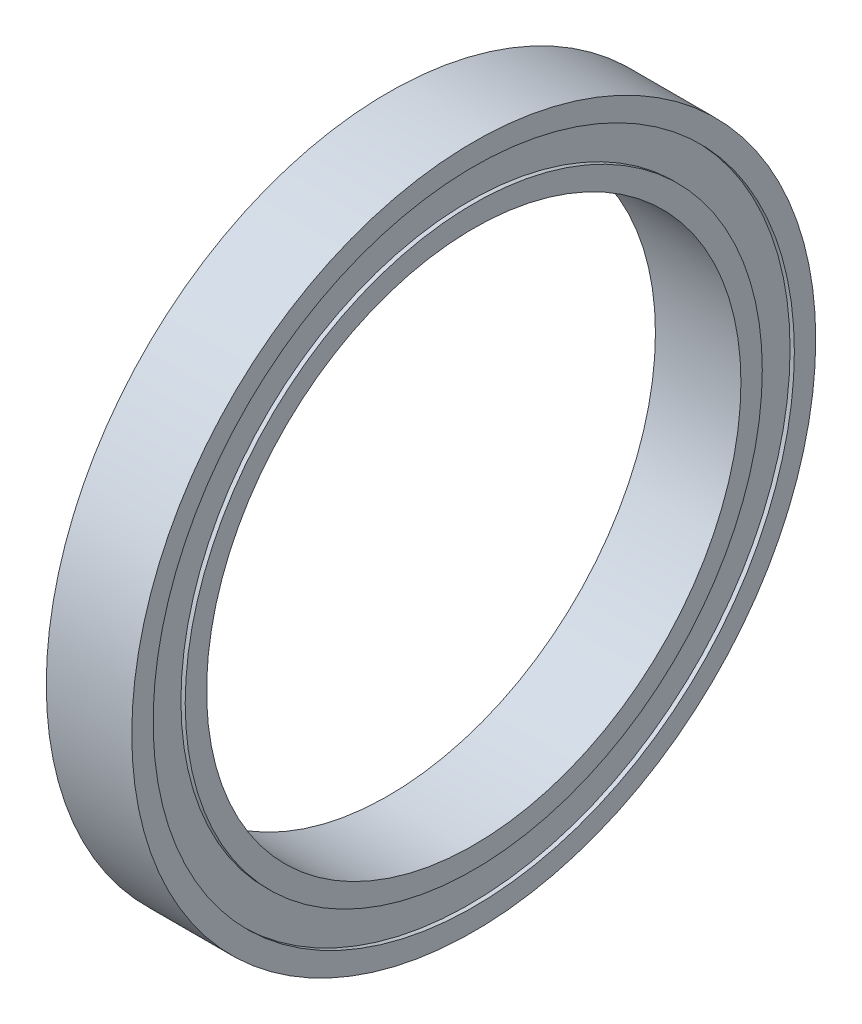
ISO-10303-21;
HEADER;
FILE_DESCRIPTION(('STEP AP214'),'2;1');
FILE_NAME('part.step','',(''),(''),'','','');
FILE_SCHEMA(('AUTOMOTIVE_DESIGN { 1 0 10303 214 1 1 1 1 }'));
ENDSEC;
DATA;
#1=APPLICATION_CONTEXT('core data for automotive mechanical design processes');
#2=APPLICATION_PROTOCOL_DEFINITION('international standard','automotive_design',2000,#1);
#3=PRODUCT_CONTEXT('',#1,'mechanical');
#4=PRODUCT('Part','Part','',(#3));
#5=PRODUCT_RELATED_PRODUCT_CATEGORY('part','',(#4));
#6=PRODUCT_DEFINITION_FORMATION('','',#4);
#7=PRODUCT_DEFINITION_CONTEXT('part definition',#1,'design');
#8=PRODUCT_DEFINITION('design','',#6,#7);
#9=PRODUCT_DEFINITION_SHAPE('','',#8);
#10=(LENGTH_UNIT() NAMED_UNIT(*) SI_UNIT(.MILLI.,.METRE.));
#11=(NAMED_UNIT(*) PLANE_ANGLE_UNIT() SI_UNIT($,.RADIAN.));
#12=(NAMED_UNIT(*) SI_UNIT($,.STERADIAN.) SOLID_ANGLE_UNIT());
#13=UNCERTAINTY_MEASURE_WITH_UNIT(LENGTH_MEASURE(1.E-05),#10,'distance_accuracy_value','');
#14=(GEOMETRIC_REPRESENTATION_CONTEXT(3) GLOBAL_UNCERTAINTY_ASSIGNED_CONTEXT((#13)) GLOBAL_UNIT_ASSIGNED_CONTEXT((#10,
#11,#12)) REPRESENTATION_CONTEXT('',''));
#15=CARTESIAN_POINT('',(0.,0.,0.));
#16=DIRECTION('',(0.,0.,1.));
#17=DIRECTION('',(1.,0.,0.));
#18=AXIS2_PLACEMENT_3D('',#15,#16,#17);
#19=CARTESIAN_POINT('',(0.,0.,0.));
#20=DIRECTION('',(1.,0.,0.));
#21=DIRECTION('',(0.,0.,-1.));
#22=AXIS2_PLACEMENT_3D('',#19,#20,#21);
#23=PLANE('',#22);
#24=CARTESIAN_POINT('',(0.,0.,0.));
#25=DIRECTION('',(1.,0.,0.));
#26=DIRECTION('',(0.,0.,-1.));
#27=AXIS2_PLACEMENT_3D('',#24,#25,#26);
#28=CIRCLE('',#27,12.5);
#29=CARTESIAN_POINT('',(0.,0.,-12.5));
#30=VERTEX_POINT('',#29);
#31=EDGE_CURVE('E49',#30,#30,#28,.T.);
#32=ORIENTED_EDGE('',*,*,#31,.T.);
#33=EDGE_LOOP('',(#32));
#34=FACE_BOUND('',#33,.T.);
#35=CARTESIAN_POINT('',(0.,0.,0.));
#36=DIRECTION('',(1.,0.,0.));
#37=DIRECTION('',(0.,0.,-1.));
#38=AXIS2_PLACEMENT_3D('',#35,#36,#37);
#39=CIRCLE('',#38,13.5);
#40=CARTESIAN_POINT('',(0.,0.,-13.5));
#41=VERTEX_POINT('',#40);
#42=EDGE_CURVE('E73',#41,#41,#39,.T.);
#43=ORIENTED_EDGE('',*,*,#42,.F.);
#44=EDGE_LOOP('',(#43));
#45=FACE_BOUND('',#44,.T.);
#46=ADVANCED_FACE('F36',(#34,#45),#23,.F.);
#47=CARTESIAN_POINT('',(4.,0.,0.));
#48=DIRECTION('',(1.,0.,0.));
#49=DIRECTION('',(0.,0.,-1.));
#50=AXIS2_PLACEMENT_3D('',#47,#48,#49);
#51=PLANE('',#50);
#52=CARTESIAN_POINT('',(4.,0.,0.));
#53=DIRECTION('',(1.,0.,0.));
#54=DIRECTION('',(0.,0.,-1.));
#55=AXIS2_PLACEMENT_3D('',#52,#53,#54);
#56=CIRCLE('',#55,12.5);
#57=CARTESIAN_POINT('',(4.,0.,-12.5));
#58=VERTEX_POINT('',#57);
#59=EDGE_CURVE('E47',#58,#58,#56,.T.);
#60=ORIENTED_EDGE('',*,*,#59,.F.);
#61=EDGE_LOOP('',(#60));
#62=FACE_BOUND('',#61,.T.);
#63=CARTESIAN_POINT('',(4.,0.,0.));
#64=DIRECTION('',(1.,0.,0.));
#65=DIRECTION('',(0.,0.,-1.));
#66=AXIS2_PLACEMENT_3D('',#63,#64,#65);
#67=CIRCLE('',#66,13.5);
#68=CARTESIAN_POINT('',(4.,0.,-13.5));
#69=VERTEX_POINT('',#68);
#70=EDGE_CURVE('E61',#69,#69,#67,.T.);
#71=ORIENTED_EDGE('',*,*,#70,.T.);
#72=EDGE_LOOP('',(#71));
#73=FACE_BOUND('',#72,.T.);
#74=ADVANCED_FACE('F89',(#62,#73),#51,.T.);
#75=CARTESIAN_POINT('',(4.,0.,0.));
#76=DIRECTION('',(1.,0.,0.));
#77=DIRECTION('',(0.,0.,-1.));
#78=AXIS2_PLACEMENT_3D('',#75,#76,#77);
#79=CIRCLE('',#78,15.);
#80=CARTESIAN_POINT('',(4.,0.,-15.));
#81=VERTEX_POINT('',#80);
#82=EDGE_CURVE('E55',#81,#81,#79,.T.);
#83=ORIENTED_EDGE('',*,*,#82,.F.);
#84=EDGE_LOOP('',(#83));
#85=FACE_BOUND('',#84,.T.);
#86=CARTESIAN_POINT('',(4.,0.,0.));
#87=DIRECTION('',(1.,0.,0.));
#88=DIRECTION('',(0.,0.,-1.));
#89=AXIS2_PLACEMENT_3D('',#86,#87,#88);
#90=CIRCLE('',#89,16.);
#91=CARTESIAN_POINT('',(4.,0.,-16.));
#92=VERTEX_POINT('',#91);
#93=EDGE_CURVE('E10',#92,#92,#90,.T.);
#94=ORIENTED_EDGE('',*,*,#93,.T.);
#95=EDGE_LOOP('',(#94));
#96=FACE_BOUND('',#95,.T.);
#97=ADVANCED_FACE('F95',(#85,#96),#51,.T.);
#98=CARTESIAN_POINT('',(0.,0.,0.));
#99=DIRECTION('',(1.,0.,0.));
#100=DIRECTION('',(0.,0.,-1.));
#101=AXIS2_PLACEMENT_3D('',#98,#99,#100);
#102=CIRCLE('',#101,15.);
#103=CARTESIAN_POINT('',(0.,0.,-15.));
#104=VERTEX_POINT('',#103);
#105=EDGE_CURVE('E67',#104,#104,#102,.T.);
#106=ORIENTED_EDGE('',*,*,#105,.T.);
#107=EDGE_LOOP('',(#106));
#108=FACE_BOUND('',#107,.T.);
#109=CARTESIAN_POINT('',(0.,0.,0.));
#110=DIRECTION('',(1.,0.,0.));
#111=DIRECTION('',(0.,0.,-1.));
#112=AXIS2_PLACEMENT_3D('',#109,#110,#111);
#113=CIRCLE('',#112,16.);
#114=CARTESIAN_POINT('',(0.,0.,-16.));
#115=VERTEX_POINT('',#114);
#116=EDGE_CURVE('E40',#115,#115,#113,.T.);
#117=ORIENTED_EDGE('',*,*,#116,.F.);
#118=EDGE_LOOP('',(#117));
#119=FACE_BOUND('',#118,.T.);
#120=ADVANCED_FACE('F91',(#108,#119),#23,.F.);
#121=CARTESIAN_POINT('',(4.,0.,0.));
#122=DIRECTION('',(-1.,0.,0.));
#123=DIRECTION('',(0.,0.,1.));
#124=AXIS2_PLACEMENT_3D('',#121,#122,#123);
#125=CYLINDRICAL_SURFACE('',#124,16.);
#126=ORIENTED_EDGE('',*,*,#93,.F.);
#127=EDGE_LOOP('',(#126));
#128=FACE_BOUND('',#127,.T.);
#129=ORIENTED_EDGE('',*,*,#116,.T.);
#130=EDGE_LOOP('',(#129));
#131=FACE_BOUND('',#130,.T.);
#132=ADVANCED_FACE('F38',(#128,#131),#125,.T.);
#133=CARTESIAN_POINT('',(4.,0.,0.));
#134=DIRECTION('',(-1.,0.,0.));
#135=DIRECTION('',(0.,0.,1.));
#136=AXIS2_PLACEMENT_3D('',#133,#134,#135);
#137=CYLINDRICAL_SURFACE('',#136,12.5);
#138=ORIENTED_EDGE('',*,*,#59,.T.);
#139=EDGE_LOOP('',(#138));
#140=FACE_BOUND('',#139,.T.);
#141=ORIENTED_EDGE('',*,*,#31,.F.);
#142=EDGE_LOOP('',(#141));
#143=FACE_BOUND('',#142,.T.);
#144=ADVANCED_FACE('F104',(#140,#143),#137,.F.);
#145=CARTESIAN_POINT('',(3.8,0.,0.));
#146=DIRECTION('',(1.,0.,0.));
#147=DIRECTION('',(0.,0.,-1.));
#148=AXIS2_PLACEMENT_3D('',#145,#146,#147);
#149=CYLINDRICAL_SURFACE('',#148,15.);
#150=CARTESIAN_POINT('',(3.8,0.,0.));
#151=DIRECTION('',(1.,0.,0.));
#152=DIRECTION('',(0.,0.,-1.));
#153=AXIS2_PLACEMENT_3D('',#150,#151,#152);
#154=CIRCLE('',#153,15.);
#155=CARTESIAN_POINT('',(3.8,0.,-15.));
#156=VERTEX_POINT('',#155);
#157=EDGE_CURVE('E52',#156,#156,#154,.T.);
#158=ORIENTED_EDGE('',*,*,#157,.F.);
#159=EDGE_LOOP('',(#158));
#160=FACE_BOUND('',#159,.T.);
#161=ORIENTED_EDGE('',*,*,#82,.T.);
#162=EDGE_LOOP('',(#161));
#163=FACE_BOUND('',#162,.T.);
#164=ADVANCED_FACE('F128',(#160,#163),#149,.F.);
#165=CARTESIAN_POINT('',(3.8,0.,0.));
#166=DIRECTION('',(1.,0.,0.));
#167=DIRECTION('',(0.,0.,-1.));
#168=AXIS2_PLACEMENT_3D('',#165,#166,#167);
#169=PLANE('',#168);
#170=CARTESIAN_POINT('',(3.8,0.,0.));
#171=DIRECTION('',(1.,0.,0.));
#172=DIRECTION('',(0.,0.,-1.));
#173=AXIS2_PLACEMENT_3D('',#170,#171,#172);
#174=CIRCLE('',#173,13.5);
#175=CARTESIAN_POINT('',(3.8,0.,-13.5));
#176=VERTEX_POINT('',#175);
#177=EDGE_CURVE('E58',#176,#176,#174,.T.);
#178=ORIENTED_EDGE('',*,*,#177,.F.);
#179=EDGE_LOOP('',(#178));
#180=FACE_BOUND('',#179,.T.);
#181=ORIENTED_EDGE('',*,*,#157,.T.);
#182=EDGE_LOOP('',(#181));
#183=FACE_BOUND('',#182,.T.);
#184=ADVANCED_FACE('F124',(#180,#183),#169,.T.);
#185=CARTESIAN_POINT('',(3.8,0.,0.));
#186=DIRECTION('',(1.,0.,0.));
#187=DIRECTION('',(0.,0.,-1.));
#188=AXIS2_PLACEMENT_3D('',#185,#186,#187);
#189=CYLINDRICAL_SURFACE('',#188,13.5);
#190=ORIENTED_EDGE('',*,*,#177,.T.);
#191=EDGE_LOOP('',(#190));
#192=FACE_BOUND('',#191,.T.);
#193=ORIENTED_EDGE('',*,*,#70,.F.);
#194=EDGE_LOOP('',(#193));
#195=FACE_BOUND('',#194,.T.);
#196=ADVANCED_FACE('F118',(#192,#195),#189,.T.);
#197=CARTESIAN_POINT('',(0.2,0.,0.));
#198=DIRECTION('',(1.,0.,0.));
#199=DIRECTION('',(0.,0.,-1.));
#200=AXIS2_PLACEMENT_3D('',#197,#198,#199);
#201=PLANE('',#200);
#202=CARTESIAN_POINT('',(0.2,0.,0.));
#203=DIRECTION('',(1.,0.,0.));
#204=DIRECTION('',(0.,0.,-1.));
#205=AXIS2_PLACEMENT_3D('',#202,#203,#204);
#206=CIRCLE('',#205,15.);
#207=CARTESIAN_POINT('',(0.2,0.,-15.));
#208=VERTEX_POINT('',#207);
#209=EDGE_CURVE('E64',#208,#208,#206,.T.);
#210=ORIENTED_EDGE('',*,*,#209,.F.);
#211=EDGE_LOOP('',(#210));
#212=FACE_BOUND('',#211,.T.);
#213=CARTESIAN_POINT('',(0.2,0.,0.));
#214=DIRECTION('',(1.,0.,0.));
#215=DIRECTION('',(0.,0.,-1.));
#216=AXIS2_PLACEMENT_3D('',#213,#214,#215);
#217=CIRCLE('',#216,13.5);
#218=CARTESIAN_POINT('',(0.2,0.,-13.5));
#219=VERTEX_POINT('',#218);
#220=EDGE_CURVE('E70',#219,#219,#217,.T.);
#221=ORIENTED_EDGE('',*,*,#220,.T.);
#222=EDGE_LOOP('',(#221));
#223=FACE_BOUND('',#222,.T.);
#224=ADVANCED_FACE('F79',(#212,#223),#201,.F.);
#225=CARTESIAN_POINT('',(0.2,0.,0.));
#226=DIRECTION('',(-1.,0.,0.));
#227=DIRECTION('',(0.,0.,1.));
#228=AXIS2_PLACEMENT_3D('',#225,#226,#227);
#229=CYLINDRICAL_SURFACE('',#228,15.);
#230=ORIENTED_EDGE('',*,*,#209,.T.);
#231=EDGE_LOOP('',(#230));
#232=FACE_BOUND('',#231,.T.);
#233=ORIENTED_EDGE('',*,*,#105,.F.);
#234=EDGE_LOOP('',(#233));
#235=FACE_BOUND('',#234,.T.);
#236=ADVANCED_FACE('F84',(#232,#235),#229,.F.);
#237=CARTESIAN_POINT('',(0.2,0.,0.));
#238=DIRECTION('',(-1.,0.,0.));
#239=DIRECTION('',(0.,0.,1.));
#240=AXIS2_PLACEMENT_3D('',#237,#238,#239);
#241=CYLINDRICAL_SURFACE('',#240,13.5);
#242=ORIENTED_EDGE('',*,*,#220,.F.);
#243=EDGE_LOOP('',(#242));
#244=FACE_BOUND('',#243,.T.);
#245=ORIENTED_EDGE('',*,*,#42,.T.);
#246=EDGE_LOOP('',(#245));
#247=FACE_BOUND('',#246,.T.);
#248=ADVANCED_FACE('F81',(#244,#247),#241,.T.);
#249=CLOSED_SHELL('',(#46,#74,#97,#120,#132,#144,#164,#184,#196,#224,#236,#248));
#250=MANIFOLD_SOLID_BREP('B2',#249);
#251=ADVANCED_BREP_SHAPE_REPRESENTATION('',(#18,#250),#14);
#252=SHAPE_DEFINITION_REPRESENTATION(#9,#251);
ENDSEC;
END-ISO-10303-21;
